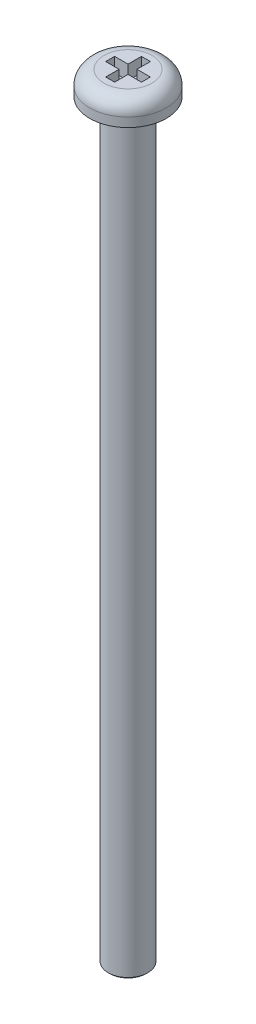
ISO-10303-21;
HEADER;
FILE_DESCRIPTION(('STEP AP214'),'2;1');
FILE_NAME('part.step','',(''),(''),'','','');
FILE_SCHEMA(('AUTOMOTIVE_DESIGN { 1 0 10303 214 1 1 1 1 }'));
ENDSEC;
DATA;
#1=APPLICATION_CONTEXT('core data for automotive mechanical design processes');
#2=APPLICATION_PROTOCOL_DEFINITION('international standard','automotive_design',2000,#1);
#3=PRODUCT_CONTEXT('',#1,'mechanical');
#4=PRODUCT('Part','Part','',(#3));
#5=PRODUCT_RELATED_PRODUCT_CATEGORY('part','',(#4));
#6=PRODUCT_DEFINITION_FORMATION('','',#4);
#7=PRODUCT_DEFINITION_CONTEXT('part definition',#1,'design');
#8=PRODUCT_DEFINITION('design','',#6,#7);
#9=PRODUCT_DEFINITION_SHAPE('','',#8);
#10=(LENGTH_UNIT() NAMED_UNIT(*) SI_UNIT(.MILLI.,.METRE.));
#11=(NAMED_UNIT(*) PLANE_ANGLE_UNIT() SI_UNIT($,.RADIAN.));
#12=(NAMED_UNIT(*) SI_UNIT($,.STERADIAN.) SOLID_ANGLE_UNIT());
#13=UNCERTAINTY_MEASURE_WITH_UNIT(LENGTH_MEASURE(1.E-05),#10,'distance_accuracy_value','');
#14=(GEOMETRIC_REPRESENTATION_CONTEXT(3) GLOBAL_UNCERTAINTY_ASSIGNED_CONTEXT((#13)) GLOBAL_UNIT_ASSIGNED_CONTEXT((#10,
#11,#12)) REPRESENTATION_CONTEXT('',''));
#15=CARTESIAN_POINT('',(0.,0.,0.));
#16=DIRECTION('',(0.,0.,1.));
#17=DIRECTION('',(1.,0.,0.));
#18=AXIS2_PLACEMENT_3D('',#15,#16,#17);
#19=CARTESIAN_POINT('',(0.,0.812800000000002,0.));
#20=DIRECTION('',(0.,1.,0.));
#21=DIRECTION('',(0.,0.,1.));
#22=AXIS2_PLACEMENT_3D('',#19,#20,#21);
#23=PLANE('',#22);
#24=DIRECTION('',(0.,0.,-1.));
#25=VECTOR('',#24,1.);
#26=CARTESIAN_POINT('',(1.5875,0.812800000000002,-0.396874999999998));
#27=LINE('',#26,#25);
#28=CARTESIAN_POINT('',(1.5875,0.812800000000002,0.396874999999998));
#29=VERTEX_POINT('',#28);
#30=CARTESIAN_POINT('',(1.5875,0.812800000000002,-0.396874999999998));
#31=VERTEX_POINT('',#30);
#32=EDGE_CURVE('E184',#29,#31,#27,.T.);
#33=ORIENTED_EDGE('',*,*,#32,.T.);
#34=DIRECTION('',(-1.,0.,0.));
#35=VECTOR('',#34,1.);
#36=CARTESIAN_POINT('',(0.396874999999998,0.812800000000002,-0.396874999999998));
#37=LINE('',#36,#35);
#38=CARTESIAN_POINT('',(0.396874999999998,0.812800000000002,-0.396874999999998));
#39=VERTEX_POINT('',#38);
#40=EDGE_CURVE('E188',#31,#39,#37,.T.);
#41=ORIENTED_EDGE('',*,*,#40,.T.);
#42=DIRECTION('',(0.,0.,-1.));
#43=VECTOR('',#42,1.);
#44=CARTESIAN_POINT('',(0.396874999999997,0.812800000000002,-1.5875));
#45=LINE('',#44,#43);
#46=CARTESIAN_POINT('',(0.396874999999997,0.812800000000002,-1.5875));
#47=VERTEX_POINT('',#46);
#48=EDGE_CURVE('E192',#39,#47,#45,.T.);
#49=ORIENTED_EDGE('',*,*,#48,.T.);
#50=DIRECTION('',(-1.,0.,0.));
#51=VECTOR('',#50,1.);
#52=CARTESIAN_POINT('',(-0.396874999999998,0.812800000000002,-1.5875));
#53=LINE('',#52,#51);
#54=CARTESIAN_POINT('',(-0.396874999999998,0.812800000000002,-1.5875));
#55=VERTEX_POINT('',#54);
#56=EDGE_CURVE('E196',#47,#55,#53,.T.);
#57=ORIENTED_EDGE('',*,*,#56,.T.);
#58=DIRECTION('',(0.,0.,1.));
#59=VECTOR('',#58,1.);
#60=CARTESIAN_POINT('',(-0.396874999999998,0.812800000000002,-1.5875));
#61=LINE('',#60,#59);
#62=CARTESIAN_POINT('',(-0.396874999999998,0.812800000000002,-0.396874999999998));
#63=VERTEX_POINT('',#62);
#64=EDGE_CURVE('E200',#55,#63,#61,.T.);
#65=ORIENTED_EDGE('',*,*,#64,.T.);
#66=DIRECTION('',(-1.,0.,0.));
#67=VECTOR('',#66,1.);
#68=CARTESIAN_POINT('',(-1.5875,0.812800000000002,-0.396874999999998));
#69=LINE('',#68,#67);
#70=CARTESIAN_POINT('',(-1.5875,0.812800000000002,-0.396874999999998));
#71=VERTEX_POINT('',#70);
#72=EDGE_CURVE('E204',#63,#71,#69,.T.);
#73=ORIENTED_EDGE('',*,*,#72,.T.);
#74=DIRECTION('',(0.,0.,1.));
#75=VECTOR('',#74,1.);
#76=CARTESIAN_POINT('',(-1.5875,0.812800000000002,-0.396874999999998));
#77=LINE('',#76,#75);
#78=CARTESIAN_POINT('',(-1.5875,0.812800000000002,0.396874999999998));
#79=VERTEX_POINT('',#78);
#80=EDGE_CURVE('E206',#71,#79,#77,.T.);
#81=ORIENTED_EDGE('',*,*,#80,.T.);
#82=DIRECTION('',(1.,0.,0.));
#83=VECTOR('',#82,1.);
#84=CARTESIAN_POINT('',(-1.5875,0.812800000000002,0.396874999999998));
#85=LINE('',#84,#83);
#86=CARTESIAN_POINT('',(-0.396874999999998,0.812800000000002,0.396874999999998));
#87=VERTEX_POINT('',#86);
#88=EDGE_CURVE('E122',#79,#87,#85,.T.);
#89=ORIENTED_EDGE('',*,*,#88,.T.);
#90=DIRECTION('',(0.,0.,1.));
#91=VECTOR('',#90,1.);
#92=CARTESIAN_POINT('',(-0.396874999999998,0.812800000000002,0.396874999999998));
#93=LINE('',#92,#91);
#94=CARTESIAN_POINT('',(-0.396874999999998,0.812800000000002,1.5875));
#95=VERTEX_POINT('',#94);
#96=EDGE_CURVE('E118',#87,#95,#93,.T.);
#97=ORIENTED_EDGE('',*,*,#96,.T.);
#98=DIRECTION('',(1.,0.,0.));
#99=VECTOR('',#98,1.);
#100=CARTESIAN_POINT('',(-0.396874999999997,0.812800000000002,1.5875));
#101=LINE('',#100,#99);
#102=CARTESIAN_POINT('',(0.396874999999998,0.812800000000002,1.5875));
#103=VERTEX_POINT('',#102);
#104=EDGE_CURVE('E172',#95,#103,#101,.T.);
#105=ORIENTED_EDGE('',*,*,#104,.T.);
#106=DIRECTION('',(0.,0.,-1.));
#107=VECTOR('',#106,1.);
#108=CARTESIAN_POINT('',(0.396874999999998,0.812800000000002,0.396874999999998));
#109=LINE('',#108,#107);
#110=CARTESIAN_POINT('',(0.396874999999998,0.812800000000002,0.396874999999998));
#111=VERTEX_POINT('',#110);
#112=EDGE_CURVE('E176',#103,#111,#109,.T.);
#113=ORIENTED_EDGE('',*,*,#112,.T.);
#114=DIRECTION('',(1.,0.,0.));
#115=VECTOR('',#114,1.);
#116=CARTESIAN_POINT('',(0.396874999999998,0.812800000000002,0.396874999999998));
#117=LINE('',#116,#115);
#118=EDGE_CURVE('E180',#111,#29,#117,.T.);
#119=ORIENTED_EDGE('',*,*,#118,.T.);
#120=EDGE_LOOP('',(#33,#41,#49,#57,#65,#73,#81,#89,#97,#105,#113,#119));
#121=FACE_BOUND('',#120,.T.);
#122=ADVANCED_FACE('F16',(#121),#23,.T.);
#123=CARTESIAN_POINT('',(-1.5875,0.812800000000002,-0.396874999999998));
#124=DIRECTION('',(-1.,0.,0.));
#125=DIRECTION('',(0.,0.,1.));
#126=AXIS2_PLACEMENT_3D('',#123,#124,#125);
#127=PLANE('',#126);
#128=ORIENTED_EDGE('',*,*,#80,.F.);
#129=DIRECTION('',(0.,1.,0.));
#130=VECTOR('',#129,1.);
#131=CARTESIAN_POINT('',(-1.5875,0.812800000000002,-0.396874999999998));
#132=LINE('',#131,#130);
#133=CARTESIAN_POINT('',(-1.5875,2.0828,-0.396874999999998));
#134=VERTEX_POINT('',#133);
#135=EDGE_CURVE('E202',#71,#134,#132,.T.);
#136=ORIENTED_EDGE('',*,*,#135,.T.);
#137=DIRECTION('',(0.,0.,1.));
#138=VECTOR('',#137,1.);
#139=CARTESIAN_POINT('',(-1.5875,2.0828,0.));
#140=LINE('',#139,#138);
#141=CARTESIAN_POINT('',(-1.5875,2.0828,0.396874999999998));
#142=VERTEX_POINT('',#141);
#143=EDGE_CURVE('E121',#142,#134,#140,.F.);
#144=ORIENTED_EDGE('',*,*,#143,.F.);
#145=DIRECTION('',(0.,1.,0.));
#146=VECTOR('',#145,1.);
#147=CARTESIAN_POINT('',(-1.5875,0.812800000000002,0.396874999999998));
#148=LINE('',#147,#146);
#149=EDGE_CURVE('E129',#142,#79,#148,.F.);
#150=ORIENTED_EDGE('',*,*,#149,.T.);
#151=EDGE_LOOP('',(#128,#136,#144,#150));
#152=FACE_BOUND('',#151,.T.);
#153=ADVANCED_FACE('F222',(#152),#127,.F.);
#154=CARTESIAN_POINT('',(-1.5875,0.812800000000002,-0.396874999999998));
#155=DIRECTION('',(0.,0.,-1.));
#156=DIRECTION('',(-1.,0.,0.));
#157=AXIS2_PLACEMENT_3D('',#154,#155,#156);
#158=PLANE('',#157);
#159=ORIENTED_EDGE('',*,*,#72,.F.);
#160=DIRECTION('',(0.,1.,0.));
#161=VECTOR('',#160,1.);
#162=CARTESIAN_POINT('',(-0.396874999999998,0.812800000000002,-0.396874999999998));
#163=LINE('',#162,#161);
#164=CARTESIAN_POINT('',(-0.396874999999998,2.0828,-0.396874999999998));
#165=VERTEX_POINT('',#164);
#166=EDGE_CURVE('E198',#63,#165,#163,.T.);
#167=ORIENTED_EDGE('',*,*,#166,.T.);
#168=DIRECTION('',(1.,0.,0.));
#169=VECTOR('',#168,1.);
#170=CARTESIAN_POINT('',(0.,2.0828,-0.396874999999998));
#171=LINE('',#170,#169);
#172=EDGE_CURVE('E161',#134,#165,#171,.T.);
#173=ORIENTED_EDGE('',*,*,#172,.F.);
#174=ORIENTED_EDGE('',*,*,#135,.F.);
#175=EDGE_LOOP('',(#159,#167,#173,#174));
#176=FACE_BOUND('',#175,.T.);
#177=ADVANCED_FACE('F226',(#176),#158,.F.);
#178=CARTESIAN_POINT('',(-0.396874999999998,0.812800000000002,-1.5875));
#179=DIRECTION('',(-1.,0.,0.));
#180=DIRECTION('',(0.,0.,1.));
#181=AXIS2_PLACEMENT_3D('',#178,#179,#180);
#182=PLANE('',#181);
#183=ORIENTED_EDGE('',*,*,#64,.F.);
#184=DIRECTION('',(0.,1.,0.));
#185=VECTOR('',#184,1.);
#186=CARTESIAN_POINT('',(-0.396874999999998,0.812800000000002,-1.5875));
#187=LINE('',#186,#185);
#188=CARTESIAN_POINT('',(-0.396874999999998,2.0828,-1.5875));
#189=VERTEX_POINT('',#188);
#190=EDGE_CURVE('E194',#55,#189,#187,.T.);
#191=ORIENTED_EDGE('',*,*,#190,.T.);
#192=DIRECTION('',(0.,0.,1.));
#193=VECTOR('',#192,1.);
#194=CARTESIAN_POINT('',(-0.396874999999998,2.0828,0.));
#195=LINE('',#194,#193);
#196=EDGE_CURVE('E158',#165,#189,#195,.F.);
#197=ORIENTED_EDGE('',*,*,#196,.F.);
#198=ORIENTED_EDGE('',*,*,#166,.F.);
#199=EDGE_LOOP('',(#183,#191,#197,#198));
#200=FACE_BOUND('',#199,.T.);
#201=ADVANCED_FACE('F230',(#200),#182,.F.);
#202=CARTESIAN_POINT('',(-0.396874999999998,0.812800000000002,-1.5875));
#203=DIRECTION('',(0.,0.,-1.));
#204=DIRECTION('',(-1.,0.,0.));
#205=AXIS2_PLACEMENT_3D('',#202,#203,#204);
#206=PLANE('',#205);
#207=ORIENTED_EDGE('',*,*,#56,.F.);
#208=DIRECTION('',(0.,1.,0.));
#209=VECTOR('',#208,1.);
#210=CARTESIAN_POINT('',(0.396874999999997,0.812800000000002,-1.5875));
#211=LINE('',#210,#209);
#212=CARTESIAN_POINT('',(0.396874999999997,2.0828,-1.5875));
#213=VERTEX_POINT('',#212);
#214=EDGE_CURVE('E190',#47,#213,#211,.T.);
#215=ORIENTED_EDGE('',*,*,#214,.T.);
#216=DIRECTION('',(1.,0.,0.));
#217=VECTOR('',#216,1.);
#218=CARTESIAN_POINT('',(0.,2.0828,-1.5875));
#219=LINE('',#218,#217);
#220=EDGE_CURVE('E155',#189,#213,#219,.T.);
#221=ORIENTED_EDGE('',*,*,#220,.F.);
#222=ORIENTED_EDGE('',*,*,#190,.F.);
#223=EDGE_LOOP('',(#207,#215,#221,#222));
#224=FACE_BOUND('',#223,.T.);
#225=ADVANCED_FACE('F234',(#224),#206,.F.);
#226=CARTESIAN_POINT('',(0.396874999999997,0.812800000000002,-1.5875));
#227=DIRECTION('',(1.,0.,0.));
#228=DIRECTION('',(0.,0.,-1.));
#229=AXIS2_PLACEMENT_3D('',#226,#227,#228);
#230=PLANE('',#229);
#231=ORIENTED_EDGE('',*,*,#48,.F.);
#232=DIRECTION('',(0.,1.,0.));
#233=VECTOR('',#232,1.);
#234=CARTESIAN_POINT('',(0.396874999999998,0.812800000000002,-0.396874999999998));
#235=LINE('',#234,#233);
#236=CARTESIAN_POINT('',(0.396874999999997,2.0828,-0.396874999999998));
#237=VERTEX_POINT('',#236);
#238=EDGE_CURVE('E186',#39,#237,#235,.T.);
#239=ORIENTED_EDGE('',*,*,#238,.T.);
#240=DIRECTION('',(0.,0.,1.));
#241=VECTOR('',#240,1.);
#242=CARTESIAN_POINT('',(0.396874999999997,2.0828,0.));
#243=LINE('',#242,#241);
#244=EDGE_CURVE('E152',#213,#237,#243,.T.);
#245=ORIENTED_EDGE('',*,*,#244,.F.);
#246=ORIENTED_EDGE('',*,*,#214,.F.);
#247=EDGE_LOOP('',(#231,#239,#245,#246));
#248=FACE_BOUND('',#247,.T.);
#249=ADVANCED_FACE('F238',(#248),#230,.F.);
#250=CARTESIAN_POINT('',(0.396874999999998,0.812800000000002,-0.396874999999998));
#251=DIRECTION('',(0.,0.,-1.));
#252=DIRECTION('',(-1.,0.,0.));
#253=AXIS2_PLACEMENT_3D('',#250,#251,#252);
#254=PLANE('',#253);
#255=ORIENTED_EDGE('',*,*,#40,.F.);
#256=DIRECTION('',(0.,1.,0.));
#257=VECTOR('',#256,1.);
#258=CARTESIAN_POINT('',(1.5875,0.812800000000002,-0.396874999999998));
#259=LINE('',#258,#257);
#260=CARTESIAN_POINT('',(1.5875,2.0828,-0.396874999999998));
#261=VERTEX_POINT('',#260);
#262=EDGE_CURVE('E182',#31,#261,#259,.T.);
#263=ORIENTED_EDGE('',*,*,#262,.T.);
#264=DIRECTION('',(1.,0.,0.));
#265=VECTOR('',#264,1.);
#266=CARTESIAN_POINT('',(0.,2.0828,-0.396874999999998));
#267=LINE('',#266,#265);
#268=EDGE_CURVE('E149',#237,#261,#267,.T.);
#269=ORIENTED_EDGE('',*,*,#268,.F.);
#270=ORIENTED_EDGE('',*,*,#238,.F.);
#271=EDGE_LOOP('',(#255,#263,#269,#270));
#272=FACE_BOUND('',#271,.T.);
#273=ADVANCED_FACE('F242',(#272),#254,.F.);
#274=CARTESIAN_POINT('',(1.5875,0.812800000000002,-0.396874999999998));
#275=DIRECTION('',(1.,0.,0.));
#276=DIRECTION('',(0.,0.,-1.));
#277=AXIS2_PLACEMENT_3D('',#274,#275,#276);
#278=PLANE('',#277);
#279=ORIENTED_EDGE('',*,*,#32,.F.);
#280=DIRECTION('',(0.,1.,0.));
#281=VECTOR('',#280,1.);
#282=CARTESIAN_POINT('',(1.5875,0.812800000000002,0.396874999999998));
#283=LINE('',#282,#281);
#284=CARTESIAN_POINT('',(1.5875,2.0828,0.396874999999998));
#285=VERTEX_POINT('',#284);
#286=EDGE_CURVE('E178',#29,#285,#283,.T.);
#287=ORIENTED_EDGE('',*,*,#286,.T.);
#288=DIRECTION('',(0.,0.,1.));
#289=VECTOR('',#288,1.);
#290=CARTESIAN_POINT('',(1.5875,2.0828,0.));
#291=LINE('',#290,#289);
#292=EDGE_CURVE('E146',#261,#285,#291,.T.);
#293=ORIENTED_EDGE('',*,*,#292,.F.);
#294=ORIENTED_EDGE('',*,*,#262,.F.);
#295=EDGE_LOOP('',(#279,#287,#293,#294));
#296=FACE_BOUND('',#295,.T.);
#297=ADVANCED_FACE('F246',(#296),#278,.F.);
#298=CARTESIAN_POINT('',(0.396874999999998,0.812800000000002,0.396874999999998));
#299=DIRECTION('',(0.,0.,1.));
#300=DIRECTION('',(1.,0.,0.));
#301=AXIS2_PLACEMENT_3D('',#298,#299,#300);
#302=PLANE('',#301);
#303=ORIENTED_EDGE('',*,*,#118,.F.);
#304=DIRECTION('',(0.,1.,0.));
#305=VECTOR('',#304,1.);
#306=CARTESIAN_POINT('',(0.396874999999998,0.812800000000002,0.396874999999998));
#307=LINE('',#306,#305);
#308=CARTESIAN_POINT('',(0.396874999999998,2.0828,0.396874999999998));
#309=VERTEX_POINT('',#308);
#310=EDGE_CURVE('E174',#111,#309,#307,.T.);
#311=ORIENTED_EDGE('',*,*,#310,.T.);
#312=DIRECTION('',(1.,0.,0.));
#313=VECTOR('',#312,1.);
#314=CARTESIAN_POINT('',(0.,2.0828,0.396874999999998));
#315=LINE('',#314,#313);
#316=EDGE_CURVE('E143',#285,#309,#315,.F.);
#317=ORIENTED_EDGE('',*,*,#316,.F.);
#318=ORIENTED_EDGE('',*,*,#286,.F.);
#319=EDGE_LOOP('',(#303,#311,#317,#318));
#320=FACE_BOUND('',#319,.T.);
#321=ADVANCED_FACE('F250',(#320),#302,.F.);
#322=CARTESIAN_POINT('',(0.396874999999998,0.812800000000002,0.396874999999998));
#323=DIRECTION('',(1.,0.,0.));
#324=DIRECTION('',(0.,0.,-1.));
#325=AXIS2_PLACEMENT_3D('',#322,#323,#324);
#326=PLANE('',#325);
#327=ORIENTED_EDGE('',*,*,#112,.F.);
#328=DIRECTION('',(0.,1.,0.));
#329=VECTOR('',#328,1.);
#330=CARTESIAN_POINT('',(0.396874999999999,0.812800000000002,1.5875));
#331=LINE('',#330,#329);
#332=CARTESIAN_POINT('',(0.396874999999998,2.0828,1.5875));
#333=VERTEX_POINT('',#332);
#334=EDGE_CURVE('E170',#103,#333,#331,.T.);
#335=ORIENTED_EDGE('',*,*,#334,.T.);
#336=DIRECTION('',(0.,0.,1.));
#337=VECTOR('',#336,1.);
#338=CARTESIAN_POINT('',(0.396874999999998,2.0828,0.));
#339=LINE('',#338,#337);
#340=EDGE_CURVE('E138',#309,#333,#339,.T.);
#341=ORIENTED_EDGE('',*,*,#340,.F.);
#342=ORIENTED_EDGE('',*,*,#310,.F.);
#343=EDGE_LOOP('',(#327,#335,#341,#342));
#344=FACE_BOUND('',#343,.T.);
#345=ADVANCED_FACE('F254',(#344),#326,.F.);
#346=CARTESIAN_POINT('',(-0.396874999999997,0.812800000000002,1.5875));
#347=DIRECTION('',(0.,0.,1.));
#348=DIRECTION('',(1.,0.,0.));
#349=AXIS2_PLACEMENT_3D('',#346,#347,#348);
#350=PLANE('',#349);
#351=ORIENTED_EDGE('',*,*,#104,.F.);
#352=DIRECTION('',(0.,1.,0.));
#353=VECTOR('',#352,1.);
#354=CARTESIAN_POINT('',(-0.396874999999998,0.812800000000002,1.5875));
#355=LINE('',#354,#353);
#356=CARTESIAN_POINT('',(-0.396874999999997,2.0828,1.5875));
#357=VERTEX_POINT('',#356);
#358=EDGE_CURVE('E167',#95,#357,#355,.T.);
#359=ORIENTED_EDGE('',*,*,#358,.T.);
#360=DIRECTION('',(1.,0.,0.));
#361=VECTOR('',#360,1.);
#362=CARTESIAN_POINT('',(0.,2.0828,1.5875));
#363=LINE('',#362,#361);
#364=EDGE_CURVE('E136',#333,#357,#363,.F.);
#365=ORIENTED_EDGE('',*,*,#364,.F.);
#366=ORIENTED_EDGE('',*,*,#334,.F.);
#367=EDGE_LOOP('',(#351,#359,#365,#366));
#368=FACE_BOUND('',#367,.T.);
#369=ADVANCED_FACE('F258',(#368),#350,.F.);
#370=CARTESIAN_POINT('',(-0.396874999999998,0.812800000000002,0.396874999999998));
#371=DIRECTION('',(-1.,0.,0.));
#372=DIRECTION('',(0.,0.,1.));
#373=AXIS2_PLACEMENT_3D('',#370,#371,#372);
#374=PLANE('',#373);
#375=ORIENTED_EDGE('',*,*,#96,.F.);
#376=DIRECTION('',(0.,1.,0.));
#377=VECTOR('',#376,1.);
#378=CARTESIAN_POINT('',(-0.396874999999998,0.812800000000002,0.396874999999998));
#379=LINE('',#378,#377);
#380=CARTESIAN_POINT('',(-0.396874999999998,2.0828,0.396874999999998));
#381=VERTEX_POINT('',#380);
#382=EDGE_CURVE('E111',#87,#381,#379,.T.);
#383=ORIENTED_EDGE('',*,*,#382,.T.);
#384=DIRECTION('',(0.,0.,1.));
#385=VECTOR('',#384,1.);
#386=CARTESIAN_POINT('',(-0.396874999999997,2.0828,0.));
#387=LINE('',#386,#385);
#388=EDGE_CURVE('E116',#357,#381,#387,.F.);
#389=ORIENTED_EDGE('',*,*,#388,.F.);
#390=ORIENTED_EDGE('',*,*,#358,.F.);
#391=EDGE_LOOP('',(#375,#383,#389,#390));
#392=FACE_BOUND('',#391,.T.);
#393=ADVANCED_FACE('F113',(#392),#374,.F.);
#394=CARTESIAN_POINT('',(-1.5875,0.812800000000002,0.396874999999998));
#395=DIRECTION('',(0.,0.,1.));
#396=DIRECTION('',(1.,0.,0.));
#397=AXIS2_PLACEMENT_3D('',#394,#395,#396);
#398=PLANE('',#397);
#399=ORIENTED_EDGE('',*,*,#88,.F.);
#400=ORIENTED_EDGE('',*,*,#149,.F.);
#401=DIRECTION('',(1.,0.,0.));
#402=VECTOR('',#401,1.);
#403=CARTESIAN_POINT('',(0.,2.0828,0.396874999999998));
#404=LINE('',#403,#402);
#405=EDGE_CURVE('E126',#381,#142,#404,.F.);
#406=ORIENTED_EDGE('',*,*,#405,.F.);
#407=ORIENTED_EDGE('',*,*,#382,.F.);
#408=EDGE_LOOP('',(#399,#400,#406,#407));
#409=FACE_BOUND('',#408,.T.);
#410=ADVANCED_FACE('F127',(#409),#398,.F.);
#411=CARTESIAN_POINT('',(0.,2.0828,0.));
#412=DIRECTION('',(0.,1.,0.));
#413=DIRECTION('',(0.,0.,1.));
#414=AXIS2_PLACEMENT_3D('',#411,#412,#413);
#415=PLANE('',#414);
#416=ORIENTED_EDGE('',*,*,#388,.T.);
#417=ORIENTED_EDGE('',*,*,#405,.T.);
#418=ORIENTED_EDGE('',*,*,#143,.T.);
#419=ORIENTED_EDGE('',*,*,#172,.T.);
#420=ORIENTED_EDGE('',*,*,#196,.T.);
#421=ORIENTED_EDGE('',*,*,#220,.T.);
#422=ORIENTED_EDGE('',*,*,#244,.T.);
#423=ORIENTED_EDGE('',*,*,#268,.T.);
#424=ORIENTED_EDGE('',*,*,#292,.T.);
#425=ORIENTED_EDGE('',*,*,#316,.T.);
#426=ORIENTED_EDGE('',*,*,#340,.T.);
#427=ORIENTED_EDGE('',*,*,#364,.T.);
#428=EDGE_LOOP('',(#416,#417,#418,#419,#420,#421,#422,#423,#424,#425,#426,#427));
#429=FACE_BOUND('',#428,.T.);
#430=CARTESIAN_POINT('',(0.,2.0828,-2.1336));
#431=CARTESIAN_POINT('',(0.0326898817068633,2.0828,-2.1336005694083));
#432=CARTESIAN_POINT('',(0.0653797180495962,2.0828,-2.13284873604939));
#433=CARTESIAN_POINT('',(0.130690362599788,2.0828,-2.12984435206687));
#434=CARTESIAN_POINT('',(0.163311170807246,2.0828,-2.12759180144327));
#435=CARTESIAN_POINT('',(0.228414821679876,2.0828,-2.12159007120115));
#436=CARTESIAN_POINT('',(0.260897664345047,2.0828,-2.11784089158263));
#437=CARTESIAN_POINT('',(0.32565677722639,2.0828,-2.10885400243004));
#438=CARTESIAN_POINT('',(0.357933047442563,2.0828,-2.10361629289597));
#439=CARTESIAN_POINT('',(0.422210834409674,2.0828,-2.09166335971463));
#440=CARTESIAN_POINT('',(0.454212351160613,2.0828,-2.08494813606735));
#441=CARTESIAN_POINT('',(0.517873033340183,2.0828,-2.07005437238435));
#442=CARTESIAN_POINT('',(0.549532198768813,2.0828,-2.06187583234862));
#443=CARTESIAN_POINT('',(0.612441302942122,2.0828,-2.04407270864914));
#444=CARTESIAN_POINT('',(0.643691241686801,2.0828,-2.03444812498539));
#445=CARTESIAN_POINT('',(0.70571588146025,2.0828,-2.01377324445576));
#446=CARTESIAN_POINT('',(0.736490582489019,2.0828,-2.00272294758988));
#447=CARTESIAN_POINT('',(0.79749974074089,2.08280000000001,-1.97921998623489));
#448=CARTESIAN_POINT('',(0.827734197963991,2.08280000000002,-1.96676732174578));
#449=CARTESIAN_POINT('',(0.887598999506393,2.08279999999999,-1.94048591571605));
#450=CARTESIAN_POINT('',(0.917229343825693,2.08279999999994,-1.92665717417543));
#451=CARTESIAN_POINT('',(0.975823342258878,2.08280000000006,-1.89765287702439));
#452=CARTESIAN_POINT('',(1.00478699637276,2.08280000000023,-1.88247732141397));
#453=CARTESIAN_POINT('',(1.06198638677769,2.08279999999978,-1.85081125873903));
#454=CARTESIAN_POINT('',(1.09022212306873,2.08279999999917,-1.83432075167451));
#455=CARTESIAN_POINT('',(1.14590620652822,2.08280000000084,-1.8000603419333));
#456=CARTESIAN_POINT('',(1.17335455369667,2.08280000000311,-1.78229043925662));
#457=CARTESIAN_POINT('',(1.22740523465358,2.08279999999689,-1.74550607962601));
#458=CARTESIAN_POINT('',(1.25400756844204,2.0827999999884,-1.72649162267208));
#459=CARTESIAN_POINT('',(1.29794459229675,2.08280000000789,-1.69354339255194));
#460=CARTESIAN_POINT('',(1.31552112783632,2.08280000002508,-1.6799306265201));
#461=CARTESIAN_POINT('',(1.3502469105536,2.08279999984912,-1.6521696664561));
#462=CARTESIAN_POINT('',(1.36739615321164,2.08279999965596,-1.6380214667644));
#463=CARTESIAN_POINT('',(1.40124978160645,2.08279999833107,-1.60920174137223));
#464=CARTESIAN_POINT('',(1.41795415729623,2.08279999719931,-1.59453020387004));
#465=CARTESIAN_POINT('',(1.45090258144889,2.08279999261002,-1.56467835399572));
#466=CARTESIAN_POINT('',(1.4671466139845,2.0827999891524,-1.5494980240596));
#467=CARTESIAN_POINT('',(1.5071618700048,2.08279997601219,-1.51092737655085));
#468=CARTESIAN_POINT('',(1.53063553668584,2.08279996408146,-1.48722726290827));
#469=CARTESIAN_POINT('',(1.57646709785272,2.08279992079263,-1.43876595451112));
#470=CARTESIAN_POINT('',(1.59882488411776,2.08279988943265,-1.41400465727153));
#471=CARTESIAN_POINT('',(1.62783594887987,2.08279983548886,-1.38032018884017));
#472=CARTESIAN_POINT('',(1.63501771417288,2.08279982100232,-1.37184863488135));
#473=CARTESIAN_POINT('',(1.64924225133114,2.08279979505328,-1.35478908347554));
#474=CARTESIAN_POINT('',(1.65628501912919,2.08279978359086,-1.34620108263357));
#475=CARTESIAN_POINT('',(1.67720414065923,2.08279975374085,-1.3202677848227));
#476=CARTESIAN_POINT('',(1.69087139961437,2.08279973989029,-1.30275309147028));
#477=CARTESIAN_POINT('',(1.71763165117075,2.08279972891874,-1.26729066599298));
#478=CARTESIAN_POINT('',(1.73072463968773,2.08279973179785,-1.24934293078967));
#479=CARTESIAN_POINT('',(1.75632309345866,2.08279975330488,-1.21303382684637));
#480=CARTESIAN_POINT('',(1.76882857462668,2.08279977193237,-1.19467246933031));
#481=CARTESIAN_POINT('',(1.79323738508853,2.08279981968414,-1.15755551213029));
#482=CARTESIAN_POINT('',(1.8051407512581,2.08279984880777,-1.13879993668954));
#483=CARTESIAN_POINT('',(1.82833618583959,2.08279990786222,-1.10091679421922));
#484=CARTESIAN_POINT('',(1.83962831254455,2.08279993779296,-1.08178926289989));
#485=CARTESIAN_POINT('',(1.86157570227613,2.08279998365496,-1.04317573977303));
#486=CARTESIAN_POINT('',(1.87223104775447,2.08279999958802,-1.02368979480279));
#487=CARTESIAN_POINT('',(1.89403109987932,2.08280000045517,-0.982345301755482));
#488=CARTESIAN_POINT('',(1.90511002243382,2.08279998196475,-0.96045216008615));
#489=CARTESIAN_POINT('',(1.92659489782662,2.08279995869967,-0.916339777137992));
#490=CARTESIAN_POINT('',(1.93700090638308,2.08279995392386,-0.894120563045799));
#491=CARTESIAN_POINT('',(1.95457253575608,2.08279996562981,-0.854951383278733));
#492=CARTESIAN_POINT('',(1.96189793812528,2.08279997709624,-0.838072627370221));
#493=CARTESIAN_POINT('',(1.9762122236215,2.08279999299281,-0.804169017644803));
#494=CARTESIAN_POINT('',(1.98320107501083,2.08279999742229,-0.787144150226851));
#495=CARTESIAN_POINT('',(1.99389343395484,2.08279999947434,-0.759668388084427));
#496=CARTESIAN_POINT('',(1.99779814446072,2.08279999910341,-0.749295720271593));
#497=CARTESIAN_POINT('',(2.01294804041389,2.0827999983263,-0.708135309751569));
#498=CARTESIAN_POINT('',(2.0236019165125,2.08279999927218,-0.67712652417993));
#499=CARTESIAN_POINT('',(2.03932768114854,2.08279999984787,-0.627600651672225));
#500=CARTESIAN_POINT('',(2.04488238790165,2.08279999986076,-0.609235295666574));
#501=CARTESIAN_POINT('',(2.05645661406455,2.08279999992722,-0.569026739390114));
#502=CARTESIAN_POINT('',(2.06237843615475,2.08279999998772,-0.547155410549249));
#503=CARTESIAN_POINT('',(2.07727230767135,2.08280000002055,-0.488455990764676));
#504=CARTESIAN_POINT('',(2.08561585573144,2.08279999990617,-0.451465625280097));
#505=CARTESIAN_POINT('',(2.09664733332817,2.08279999976089,-0.395692583942351));
#506=CARTESIAN_POINT('',(2.1000772954017,2.08279999971685,-0.377052883924561));
#507=CARTESIAN_POINT('',(2.10644040049495,2.08279999964315,-0.339688414687159));
#508=CARTESIAN_POINT('',(2.10937354468164,2.08279999961349,-0.320963645667472));
#509=CARTESIAN_POINT('',(2.11563539180931,2.08279999957402,-0.277189276927993));
#510=CARTESIAN_POINT('',(2.11877009232772,2.08279999957412,-0.252111734508754));
#511=CARTESIAN_POINT('',(2.12414845358275,2.08279999961903,-0.201861466523305));
#512=CARTESIAN_POINT('',(2.12639211320308,2.08279999966384,-0.176688740837891));
#513=CARTESIAN_POINT('',(2.12998554661774,2.08279999977585,-0.126279467435563));
#514=CARTESIAN_POINT('',(2.13133531705253,2.08279999984305,-0.10104291947914));
#515=CARTESIAN_POINT('',(2.13313956546464,2.08279999995524,-0.0505374975778596));
#516=CARTESIAN_POINT('',(2.13359403783397,2.08280000000024,-0.0252686234315075));
#517=CARTESIAN_POINT('',(2.13360470708931,2.08279999999982,0.0199494054305972));
#518=CARTESIAN_POINT('',(2.1333298580138,2.08279999997144,0.0398986545907686));
#519=CARTESIAN_POINT('',(2.13222048026913,2.0827999998635,0.0797812751515323));
#520=CARTESIAN_POINT('',(2.13138594787224,2.08279999978393,0.0997146464454855));
#521=CARTESIAN_POINT('',(2.12804381807258,2.08279999947747,0.159467666051439));
#522=CARTESIAN_POINT('',(2.12469768879857,2.08279999918281,0.199243772524942));
#523=CARTESIAN_POINT('',(2.11577982299591,2.08279999845642,0.278543770740155));
#524=CARTESIAN_POINT('',(2.11020806011491,2.08279999802469,0.31806765948988));
#525=CARTESIAN_POINT('',(2.09685639472055,2.08279999706432,0.396741780948061));
#526=CARTESIAN_POINT('',(2.08907646824096,2.08279999653568,0.435892009596245));
#527=CARTESIAN_POINT('',(2.07133293652092,2.08279999541816,0.5136946916516));
#528=CARTESIAN_POINT('',(2.06136930973474,2.08279999482928,0.552347140143386));
#529=CARTESIAN_POINT('',(2.03928971112441,2.08279999362445,0.629032740953426));
#530=CARTESIAN_POINT('',(2.02717372018766,2.0827999930085,0.667065887769121));
#531=CARTESIAN_POINT('',(2.00082751282304,2.08279999177923,0.742393036899034));
#532=CARTESIAN_POINT('',(1.98659727970732,2.0827999911659,0.779687033376451));
#533=CARTESIAN_POINT('',(1.95606737016234,2.08279998996806,0.853418434780798));
#534=CARTESIAN_POINT('',(1.93976767944063,2.08279998938354,0.889855833789684));
#535=CARTESIAN_POINT('',(1.90515015922736,2.08279998826602,0.961759270893862));
#536=CARTESIAN_POINT('',(1.88683231778892,2.08279998773302,0.997225303237389));
#537=CARTESIAN_POINT('',(1.84823616114613,2.08279998673772,1.06707430245566));
#538=CARTESIAN_POINT('',(1.82795783627056,2.08279998627544,1.10145726398642));
#539=CARTESIAN_POINT('',(1.78550455652476,2.0827999854373,1.1690318273599));
#540=CARTESIAN_POINT('',(1.76332959416952,2.08279998506144,1.20222342450022));
#541=CARTESIAN_POINT('',(1.71715286073616,2.08279998440839,1.26731071853662));
#542=CARTESIAN_POINT('',(1.69315108425094,2.08279998413119,1.29920641159659));
#543=CARTESIAN_POINT('',(1.64339630122117,2.08279998368418,1.36160143977341));
#544=CARTESIAN_POINT('',(1.617643291221,2.08279998351437,1.39210077213469));
#545=CARTESIAN_POINT('',(1.56446713893472,2.08279998328738,1.45160702100136));
#546=CARTESIAN_POINT('',(1.53704399500081,2.08279998323019,1.48061393603422));
#547=CARTESIAN_POINT('',(1.4806139360343,2.08279998323019,1.53704399500089));
#548=CARTESIAN_POINT('',(1.45160702100171,2.08279998328738,1.5644671389347));
#549=CARTESIAN_POINT('',(1.39210077213434,2.08279998351437,1.61764329122102));
#550=CARTESIAN_POINT('',(1.3616014397721,2.08279998368418,1.64339630122135));
#551=CARTESIAN_POINT('',(1.2992064115979,2.08279998413119,1.69315108425076));
#552=CARTESIAN_POINT('',(1.26731071854151,2.08279998440839,1.71715286073548));
#553=CARTESIAN_POINT('',(1.20222342449533,2.08279998506144,1.76332959417021));
#554=CARTESIAN_POINT('',(1.16903182734165,2.0827999854373,1.78550455652734));
#555=CARTESIAN_POINT('',(1.10145726400467,2.08279998627544,1.82795783626799));
#556=CARTESIAN_POINT('',(1.06707430252379,2.08279998673772,1.84823616113652));
#557=CARTESIAN_POINT('',(0.997225303169258,2.08279998773302,1.88683231779853));
#558=CARTESIAN_POINT('',(0.961759270639593,2.08279998826602,1.90515015926322));
#559=CARTESIAN_POINT('',(0.889855834043951,2.08279998938354,1.93976767940477));
#560=CARTESIAN_POINT('',(0.853418435729734,2.08279998996806,1.95606737002851));
#561=CARTESIAN_POINT('',(0.779687032427522,2.0827999911659,1.98659727984114));
#562=CARTESIAN_POINT('',(0.742393033357594,2.08279999177923,2.00082751332247));
#563=CARTESIAN_POINT('',(0.667065891310535,2.0827999930085,2.02717371968823));
#564=CARTESIAN_POINT('',(0.629032754170108,2.08279999362445,2.03928970926054));
#565=CARTESIAN_POINT('',(0.552347126926821,2.08279999482928,2.06136931159859));
#566=CARTESIAN_POINT('',(0.513694642326926,2.08279999541816,2.07133294347687));
#567=CARTESIAN_POINT('',(0.435892058920432,2.08279999653569,2.08907646128508));
#568=CARTESIAN_POINT('',(0.396741965027532,2.08279999706433,2.09685636876096));
#569=CARTESIAN_POINT('',(0.318067475412408,2.08279999802468,2.11020808607422));
#570=CARTESIAN_POINT('',(0.278543083757375,2.08279999845638,2.11577991987684));
#571=CARTESIAN_POINT('',(0.199244459499588,2.08279999918286,2.12469759191878));
#572=CARTESIAN_POINT('',(0.159470229860638,2.08279999947764,2.12804345651443));
#573=CARTESIAN_POINT('',(0.0797972818459309,2.0827999998859,2.13250019203327));
#574=CARTESIAN_POINT('',(0.0398985650735913,2.08279999999937,2.13361109162518));
#575=CARTESIAN_POINT('',(0.,2.0828,2.1336));
#576=B_SPLINE_CURVE_WITH_KNOTS('',3,(#430,#431,#432,#433,#434,#435,#436,#437,#438,#439,#440,
#441,#442,#443,#444,#445,#446,#447,#448,#449,#450,#451,#452,#453,#454,#455,#456,#457,#458,#459,
#460,#461,#462,#463,#464,#465,#466,#467,#468,#469,#470,#471,#472,#473,#474,#475,#476,#477,#478,
#479,#480,#481,#482,#483,#484,#485,#486,#487,#488,#489,#490,#491,#492,#493,#494,#495,#496,#497,
#498,#499,#500,#501,#502,#503,#504,#505,#506,#507,#508,#509,#510,#511,#512,#513,#514,#515,#516,
#517,#518,#519,#520,#521,#522,#523,#524,#525,#526,#527,#528,#529,#530,#531,#532,#533,#534,#535,
#536,#537,#538,#539,#540,#541,#542,#543,#544,#545,#546,#547,#548,#549,#550,#551,#552,#553,#554,
#555,#556,#557,#558,#559,#560,#561,#562,#563,#564,#565,#566,#567,#568,#569,#570,#571,#572,#573,
#574,#575),.UNSPECIFIED.,.F.,.F.,(4,2,2,2,2,2,2,2,2,2,2,2,2,2,2,2,2,2,2,2,2,2,2,2,2,2,2,2,2,2,2,
2,2,2,2,2,2,2,2,2,2,2,2,2,2,2,2,2,2,2,2,2,2,2,2,2,2,2,2,2,2,2,2,2,2,2,2,2,2,2,2,2,4),(0.,
0.0980609361323146,0.196121872264628,0.294182808396945,0.392243744529259,0.490304680661574,
0.588365616793889,0.686426552926203,0.784487489058518,0.882548425190832,0.980609361323148,
1.07867029745546,1.17673123358778,1.27479216972009,1.37285310585241,1.43953806267892,
1.50622372456249,1.57291089121702,1.63960036235175,1.73963567181692,1.83968066417351,
1.87299786633824,1.90631604195536,1.9729519930735,2.03958841803437,2.10622303694263,
2.17285356994615,2.23947773725398,2.30609325915437,2.37969165577131,2.45328395051966,
2.50848042748664,2.56368209948142,2.5969304407987,2.69525485689655,2.75280957487515,
2.82077613528667,2.93447230113087,2.99132504978852,3.04817766490278,3.12397934497264,
3.1997811200045,3.27558317992231,3.35138571465004,3.41123129753465,3.47107727902178,
3.59075859976018,3.71044133761275,3.83012537448667,3.94981059228908,4.06949687292714,
4.18918409830801,4.30887215033883,4.42856091092676,4.54825026197895,4.66794008540254,
4.78763026310469,4.90732067699255,5.02701120897325,5.14670174095396,5.26639215484181,
5.38608233254396,5.50577215596755,5.62546150701974,5.74515026760767,5.86483831963849,
5.98452554501936,6.10421182565742,6.22389704345983,6.34358108033375,6.46326381818633,
6.58294513892473,6.70262492445611),.UNSPECIFIED.);
#577=CARTESIAN_POINT('',(1.28895684126969E-06,2.0828,-2.13359999999922));
#578=VERTEX_POINT('',#577);
#579=CARTESIAN_POINT('',(-1.28895682468218E-06,2.0828,2.13359999999922));
#580=VERTEX_POINT('',#579);
#581=EDGE_CURVE('E33',#578,#580,#576,.T.);
#582=ORIENTED_EDGE('',*,*,#581,.F.);
#583=CARTESIAN_POINT('',(0.,2.0828,2.1336));
#584=CARTESIAN_POINT('',(-0.0326898817068631,2.0828,2.1336005694083));
#585=CARTESIAN_POINT('',(-0.0653797180495958,2.0828,2.13284873604939));
#586=CARTESIAN_POINT('',(-0.130690362599788,2.0828,2.12984435206687));
#587=CARTESIAN_POINT('',(-0.163311170807247,2.0828,2.12759180144327));
#588=CARTESIAN_POINT('',(-0.228414821679877,2.0828,2.12159007120115));
#589=CARTESIAN_POINT('',(-0.260897664345048,2.0828,2.11784089158263));
#590=CARTESIAN_POINT('',(-0.32565677722639,2.0828,2.10885400243004));
#591=CARTESIAN_POINT('',(-0.357933047442562,2.0828,2.10361629289597));
#592=CARTESIAN_POINT('',(-0.422210834409673,2.0828,2.09166335971463));
#593=CARTESIAN_POINT('',(-0.454212351160612,2.0828,2.08494813606735));
#594=CARTESIAN_POINT('',(-0.517873033340182,2.0828,2.07005437238435));
#595=CARTESIAN_POINT('',(-0.549532198768813,2.0828,2.06187583234862));
#596=CARTESIAN_POINT('',(-0.612441302942122,2.0828,2.04407270864914));
#597=CARTESIAN_POINT('',(-0.643691241686802,2.0828,2.03444812498539));
#598=CARTESIAN_POINT('',(-0.70571588146025,2.0828,2.01377324445576));
#599=CARTESIAN_POINT('',(-0.736490582489018,2.0828,2.00272294758988));
#600=CARTESIAN_POINT('',(-0.79749974074089,2.08280000000001,1.97921998623489));
#601=CARTESIAN_POINT('',(-0.827734197963993,2.08280000000002,1.96676732174578));
#602=CARTESIAN_POINT('',(-0.887598999506395,2.08279999999999,1.94048591571605));
#603=CARTESIAN_POINT('',(-0.917229343825694,2.08279999999994,1.92665717417543));
#604=CARTESIAN_POINT('',(-0.975823342258879,2.08280000000006,1.89765287702439));
#605=CARTESIAN_POINT('',(-1.00478699637276,2.08280000000023,1.88247732141397));
#606=CARTESIAN_POINT('',(-1.06198638677769,2.08279999999978,1.85081125873903));
#607=CARTESIAN_POINT('',(-1.09022212306873,2.08279999999917,1.83432075167451));
#608=CARTESIAN_POINT('',(-1.14590620652822,2.08280000000084,1.8000603419333));
#609=CARTESIAN_POINT('',(-1.17335455369667,2.08280000000311,1.78229043925662));
#610=CARTESIAN_POINT('',(-1.22740523465358,2.08279999999689,1.74550607962601));
#611=CARTESIAN_POINT('',(-1.25400756844204,2.0827999999884,1.72649162267208));
#612=CARTESIAN_POINT('',(-1.29794459229674,2.08280000000789,1.69354339255194));
#613=CARTESIAN_POINT('',(-1.31552112783631,2.08280000002508,1.67993062652011));
#614=CARTESIAN_POINT('',(-1.35024691055358,2.08279999984912,1.65216966645612));
#615=CARTESIAN_POINT('',(-1.36739615321162,2.08279999965596,1.63802146676442));
#616=CARTESIAN_POINT('',(-1.40124978160642,2.08279999833107,1.60920174137226));
#617=CARTESIAN_POINT('',(-1.41795415729619,2.08279999719931,1.59453020387007));
#618=CARTESIAN_POINT('',(-1.45090258144884,2.08279999261002,1.56467835399576));
#619=CARTESIAN_POINT('',(-1.46714661398445,2.0827999891524,1.54949802405964));
#620=CARTESIAN_POINT('',(-1.50716187000474,2.08279997601219,1.5109273765509));
#621=CARTESIAN_POINT('',(-1.53063553668577,2.08279996408146,1.48722726290833));
#622=CARTESIAN_POINT('',(-1.57646709785264,2.08279992079263,1.43876595451119));
#623=CARTESIAN_POINT('',(-1.59882488411767,2.08279988943265,1.41400465727161));
#624=CARTESIAN_POINT('',(-1.62783594887977,2.08279983548886,1.38032018884025));
#625=CARTESIAN_POINT('',(-1.63501771417279,2.08279982100232,1.37184863488143));
#626=CARTESIAN_POINT('',(-1.64924225133105,2.08279979505328,1.35478908347561));
#627=CARTESIAN_POINT('',(-1.6562850191291,2.08279978359086,1.34620108263364));
#628=CARTESIAN_POINT('',(-1.67720414065915,2.08279975374085,1.32026778482276));
#629=CARTESIAN_POINT('',(-1.6908713996143,2.08279973989029,1.30275309147034));
#630=CARTESIAN_POINT('',(-1.71763165117068,2.08279972891874,1.26729066599303));
#631=CARTESIAN_POINT('',(-1.73072463968766,2.08279973179785,1.24934293078972));
#632=CARTESIAN_POINT('',(-1.7563230934586,2.08279975330488,1.21303382684641));
#633=CARTESIAN_POINT('',(-1.76882857462663,2.08279977193237,1.19467246933034));
#634=CARTESIAN_POINT('',(-1.79323738508848,2.08279981968414,1.15755551213032));
#635=CARTESIAN_POINT('',(-1.80514075125806,2.08279984880777,1.13879993668957));
#636=CARTESIAN_POINT('',(-1.82833618583957,2.08279990786222,1.10091679421924));
#637=CARTESIAN_POINT('',(-1.83962831254453,2.08279993779296,1.0817892628999));
#638=CARTESIAN_POINT('',(-1.86157570227611,2.08279998365496,1.04317573977304));
#639=CARTESIAN_POINT('',(-1.87223104775447,2.08279999958802,1.02368979480279));
#640=CARTESIAN_POINT('',(-1.89403109987932,2.08280000045517,0.982345301755489));
#641=CARTESIAN_POINT('',(-1.90511002243382,2.08279998196475,0.960452160086165));
#642=CARTESIAN_POINT('',(-1.92659489782662,2.08279995869967,0.916339777138022));
#643=CARTESIAN_POINT('',(-1.93700090638308,2.08279995392386,0.894120563045837));
#644=CARTESIAN_POINT('',(-1.95457253575607,2.08279996562981,0.854951383278783));
#645=CARTESIAN_POINT('',(-1.96189793812528,2.08279997709624,0.838072627370276));
#646=CARTESIAN_POINT('',(-1.9762122236215,2.08279999299281,0.804169017644869));
#647=CARTESIAN_POINT('',(-1.98320107501083,2.08279999742229,0.787144150226922));
#648=CARTESIAN_POINT('',(-1.99389343395469,2.08279999947434,0.759668388084843));
#649=CARTESIAN_POINT('',(-1.99779814446044,2.08279999910341,0.749295720272352));
#650=CARTESIAN_POINT('',(-2.01294804041352,2.0827999983263,0.70813530975263));
#651=CARTESIAN_POINT('',(-2.02360191651216,2.08279999927218,0.677126524180951));
#652=CARTESIAN_POINT('',(-2.03932768114828,2.08279999984787,0.627600651673075));
#653=CARTESIAN_POINT('',(-2.04488238790144,2.08279999986076,0.609235295667294));
#654=CARTESIAN_POINT('',(-2.05645661406444,2.08279999992722,0.569026739390509));
#655=CARTESIAN_POINT('',(-2.0623784361547,2.08279999998772,0.547155410549447));
#656=CARTESIAN_POINT('',(-2.07727230767135,2.08280000002055,0.488455990764676));
#657=CARTESIAN_POINT('',(-2.08561585573144,2.08279999990617,0.451465625280097));
#658=CARTESIAN_POINT('',(-2.09664733332817,2.08279999976089,0.395692583942351));
#659=CARTESIAN_POINT('',(-2.1000772954017,2.08279999971685,0.377052883924561));
#660=CARTESIAN_POINT('',(-2.10644040049495,2.08279999964315,0.33968841468716));
#661=CARTESIAN_POINT('',(-2.10937354468164,2.08279999961349,0.320963645667474));
#662=CARTESIAN_POINT('',(-2.11563539180931,2.08279999957402,0.277189276927994));
#663=CARTESIAN_POINT('',(-2.11877009232772,2.08279999957412,0.252111734508753));
#664=CARTESIAN_POINT('',(-2.12414845358275,2.08279999961903,0.201861466523304));
#665=CARTESIAN_POINT('',(-2.12639211320308,2.08279999966384,0.176688740837892));
#666=CARTESIAN_POINT('',(-2.12998554661774,2.08279999977585,0.126279467435564));
#667=CARTESIAN_POINT('',(-2.13133531705253,2.08279999984305,0.101042919479141));
#668=CARTESIAN_POINT('',(-2.13313956546464,2.08279999995524,0.0505374975778599));
#669=CARTESIAN_POINT('',(-2.13359403783397,2.08280000000024,0.0252686234315075));
#670=CARTESIAN_POINT('',(-2.13360470708931,2.08279999999982,-0.0199494054305973));
#671=CARTESIAN_POINT('',(-2.1333298580138,2.08279999997144,-0.0398986545907685));
#672=CARTESIAN_POINT('',(-2.13222048026913,2.0827999998635,-0.0797812751515322));
#673=CARTESIAN_POINT('',(-2.13138594787224,2.08279999978393,-0.0997146464454856));
#674=CARTESIAN_POINT('',(-2.12804381807258,2.08279999947747,-0.15946766605144));
#675=CARTESIAN_POINT('',(-2.12469768879857,2.08279999918281,-0.199243772524944));
#676=CARTESIAN_POINT('',(-2.11577982299591,2.08279999845642,-0.278543770740157));
#677=CARTESIAN_POINT('',(-2.11020806011491,2.08279999802469,-0.318067659489882));
#678=CARTESIAN_POINT('',(-2.09685639472055,2.08279999706432,-0.396741780948062));
#679=CARTESIAN_POINT('',(-2.08907646824096,2.08279999653568,-0.435892009596246));
#680=CARTESIAN_POINT('',(-2.07133293652092,2.08279999541816,-0.5136946916516));
#681=CARTESIAN_POINT('',(-2.06136930973474,2.08279999482928,-0.552347140143386));
#682=CARTESIAN_POINT('',(-2.03928971112441,2.08279999362445,-0.629032740953425));
#683=CARTESIAN_POINT('',(-2.02717372018766,2.0827999930085,-0.66706588776912));
#684=CARTESIAN_POINT('',(-2.00082751282304,2.08279999177923,-0.742393036899034));
#685=CARTESIAN_POINT('',(-1.98659727970732,2.0827999911659,-0.779687033376452));
#686=CARTESIAN_POINT('',(-1.95606737016234,2.08279998996806,-0.853418434780799));
#687=CARTESIAN_POINT('',(-1.93976767944063,2.08279998938354,-0.889855833789685));
#688=CARTESIAN_POINT('',(-1.90515015922736,2.08279998826602,-0.961759270893863));
#689=CARTESIAN_POINT('',(-1.88683231778892,2.08279998773302,-0.99722530323739));
#690=CARTESIAN_POINT('',(-1.84823616114613,2.08279998673772,-1.06707430245566));
#691=CARTESIAN_POINT('',(-1.82795783627056,2.08279998627544,-1.10145726398642));
#692=CARTESIAN_POINT('',(-1.78550455652476,2.0827999854373,-1.1690318273599));
#693=CARTESIAN_POINT('',(-1.76332959416952,2.08279998506144,-1.20222342450022));
#694=CARTESIAN_POINT('',(-1.71715286073616,2.08279998440839,-1.26731071853662));
#695=CARTESIAN_POINT('',(-1.69315108425094,2.08279998413119,-1.29920641159659));
#696=CARTESIAN_POINT('',(-1.64339630122117,2.08279998368418,-1.36160143977341));
#697=CARTESIAN_POINT('',(-1.617643291221,2.08279998351437,-1.39210077213469));
#698=CARTESIAN_POINT('',(-1.56446713893472,2.08279998328738,-1.45160702100136));
#699=CARTESIAN_POINT('',(-1.53704399500081,2.08279998323019,-1.48061393603422));
#700=CARTESIAN_POINT('',(-1.4806139360343,2.08279998323019,-1.53704399500089));
#701=CARTESIAN_POINT('',(-1.45160702100171,2.08279998328738,-1.5644671389347));
#702=CARTESIAN_POINT('',(-1.39210077213434,2.08279998351437,-1.61764329122102));
#703=CARTESIAN_POINT('',(-1.3616014397721,2.08279998368418,-1.64339630122135));
#704=CARTESIAN_POINT('',(-1.2992064115979,2.08279998413119,-1.69315108425076));
#705=CARTESIAN_POINT('',(-1.26731071854151,2.08279998440839,-1.71715286073548));
#706=CARTESIAN_POINT('',(-1.20222342449533,2.08279998506144,-1.76332959417021));
#707=CARTESIAN_POINT('',(-1.16903182734165,2.0827999854373,-1.78550455652734));
#708=CARTESIAN_POINT('',(-1.10145726400467,2.08279998627544,-1.82795783626799));
#709=CARTESIAN_POINT('',(-1.06707430252379,2.08279998673772,-1.84823616113652));
#710=CARTESIAN_POINT('',(-0.997225303169259,2.08279998773302,-1.88683231779853));
#711=CARTESIAN_POINT('',(-0.961759270639593,2.08279998826602,-1.90515015926322));
#712=CARTESIAN_POINT('',(-0.889855834043952,2.08279998938354,-1.93976767940478));
#713=CARTESIAN_POINT('',(-0.853418435729734,2.08279998996806,-1.95606737002851));
#714=CARTESIAN_POINT('',(-0.779687032427522,2.0827999911659,-1.98659727984114));
#715=CARTESIAN_POINT('',(-0.742393033357594,2.08279999177923,-2.00082751332247));
#716=CARTESIAN_POINT('',(-0.667065891310534,2.0827999930085,-2.02717371968823));
#717=CARTESIAN_POINT('',(-0.629032754170108,2.08279999362445,-2.03928970926054));
#718=CARTESIAN_POINT('',(-0.552347126926821,2.08279999482928,-2.06136931159859));
#719=CARTESIAN_POINT('',(-0.513694642326926,2.08279999541816,-2.07133294347687));
#720=CARTESIAN_POINT('',(-0.435892058920432,2.08279999653569,-2.08907646128508));
#721=CARTESIAN_POINT('',(-0.396741965027533,2.08279999706433,-2.09685636876096));
#722=CARTESIAN_POINT('',(-0.318067475412408,2.08279999802468,-2.11020808607422));
#723=CARTESIAN_POINT('',(-0.278543083757375,2.08279999845638,-2.11577991987684));
#724=CARTESIAN_POINT('',(-0.199244459499587,2.08279999918286,-2.12469759191878));
#725=CARTESIAN_POINT('',(-0.159470229860638,2.08279999947764,-2.12804345651443));
#726=CARTESIAN_POINT('',(-0.0797972818459304,2.0827999998859,-2.13250019203327));
#727=CARTESIAN_POINT('',(-0.0398985650735909,2.08279999999937,-2.13361109162518));
#728=CARTESIAN_POINT('',(0.,2.0828,-2.1336));
#729=B_SPLINE_CURVE_WITH_KNOTS('',3,(#583,#584,#585,#586,#587,#588,#589,#590,#591,#592,#593,
#594,#595,#596,#597,#598,#599,#600,#601,#602,#603,#604,#605,#606,#607,#608,#609,#610,#611,#612,
#613,#614,#615,#616,#617,#618,#619,#620,#621,#622,#623,#624,#625,#626,#627,#628,#629,#630,#631,
#632,#633,#634,#635,#636,#637,#638,#639,#640,#641,#642,#643,#644,#645,#646,#647,#648,#649,#650,
#651,#652,#653,#654,#655,#656,#657,#658,#659,#660,#661,#662,#663,#664,#665,#666,#667,#668,#669,
#670,#671,#672,#673,#674,#675,#676,#677,#678,#679,#680,#681,#682,#683,#684,#685,#686,#687,#688,
#689,#690,#691,#692,#693,#694,#695,#696,#697,#698,#699,#700,#701,#702,#703,#704,#705,#706,#707,
#708,#709,#710,#711,#712,#713,#714,#715,#716,#717,#718,#719,#720,#721,#722,#723,#724,#725,#726,
#727,#728),.UNSPECIFIED.,.F.,.F.,(4,2,2,2,2,2,2,2,2,2,2,2,2,2,2,2,2,2,2,2,2,2,2,2,2,2,2,2,2,2,2,
2,2,2,2,2,2,2,2,2,2,2,2,2,2,2,2,2,2,2,2,2,2,2,2,2,2,2,2,2,2,2,2,2,2,2,2,2,2,2,2,2,4),(0.,
0.0980609361323136,0.196121872264629,0.294182808396945,0.392243744529258,0.490304680661572,
0.588365616793889,0.686426552926203,0.784487489058517,0.882548425190834,0.980609361323148,
1.07867029745546,1.17673123358778,1.27479216972009,1.37285310585241,1.4395380626789,
1.50622372456245,1.57291089121697,1.63960036235168,1.73963567181682,1.83968066417338,
1.87299786633812,1.90631604195525,1.97295199307341,2.0395884180343,2.10622303694257,
2.17285356994611,2.23947773725395,2.30609325915436,2.37969165577128,2.45328395051961,
2.50848042748658,2.56368209948134,2.59693044079752,2.69525485689552,2.75280957487454,
2.82077613528667,2.93447230113087,2.99132504978851,3.04817766490277,3.12397934497264,
3.19978112000449,3.27558317992231,3.35138571465004,3.41123129753465,3.47107727902177,
3.59075859976017,3.71044133761275,3.83012537448667,3.94981059228908,4.06949687292714,
4.18918409830801,4.30887215033883,4.42856091092676,4.54825026197895,4.66794008540254,
4.78763026310469,4.90732067699254,5.02701120897325,5.14670174095395,5.26639215484181,
5.38608233254396,5.50577215596755,5.62546150701974,5.74515026760767,5.86483831963849,
5.98452554501936,6.10421182565742,6.22389704345983,6.34358108033375,6.46326381818632,
6.58294513892472,6.70262492445611),.UNSPECIFIED.);
#730=EDGE_CURVE('E210',#580,#578,#729,.T.);
#731=ORIENTED_EDGE('',*,*,#730,.F.);
#732=EDGE_LOOP('',(#582,#731));
#733=FACE_BOUND('',#732,.T.);
#734=ADVANCED_FACE('F133',(#429,#733),#415,.T.);
#735=CARTESIAN_POINT('',(0.,0.812800000000002,0.));
#736=DIRECTION('',(0.,1.,0.));
#737=DIRECTION('',(0.,0.,1.));
#738=AXIS2_PLACEMENT_3D('',#735,#736,#737);
#739=TOROIDAL_SURFACE('',#738,2.1336,1.27);
#740=CARTESIAN_POINT('',(0.,0.812800000000002,0.));
#741=DIRECTION('',(0.,-1.,0.));
#742=DIRECTION('',(0.,0.,-1.));
#743=AXIS2_PLACEMENT_3D('',#740,#741,#742);
#744=CIRCLE('',#743,3.4036);
#745=CARTESIAN_POINT('',(0.,0.812800000000002,-3.4036));
#746=VERTEX_POINT('',#745);
#747=EDGE_CURVE('E301',#746,#746,#744,.T.);
#748=ORIENTED_EDGE('',*,*,#747,.F.);
#749=EDGE_LOOP('',(#748));
#750=FACE_BOUND('',#749,.T.);
#751=ORIENTED_EDGE('',*,*,#730,.T.);
#752=ORIENTED_EDGE('',*,*,#581,.T.);
#753=EDGE_LOOP('',(#751,#752));
#754=FACE_BOUND('',#753,.T.);
#755=ADVANCED_FACE('F18',(#750,#754),#739,.T.);
#756=CARTESIAN_POINT('',(0.,-66.675,0.));
#757=DIRECTION('',(0.,-1.,0.));
#758=DIRECTION('',(0.,0.,-1.));
#759=AXIS2_PLACEMENT_3D('',#756,#757,#758);
#760=CYLINDRICAL_SURFACE('',#759,3.4036);
#761=ORIENTED_EDGE('',*,*,#747,.T.);
#762=EDGE_LOOP('',(#761));
#763=FACE_BOUND('',#762,.T.);
#764=CARTESIAN_POINT('',(0.,0.,0.));
#765=DIRECTION('',(0.,-1.,0.));
#766=DIRECTION('',(0.,0.,-1.));
#767=AXIS2_PLACEMENT_3D('',#764,#765,#766);
#768=CIRCLE('',#767,3.4036);
#769=CARTESIAN_POINT('',(0.,0.,-3.4036));
#770=VERTEX_POINT('',#769);
#771=EDGE_CURVE('E21',#770,#770,#768,.T.);
#772=ORIENTED_EDGE('',*,*,#771,.F.);
#773=EDGE_LOOP('',(#772));
#774=FACE_BOUND('',#773,.T.);
#775=ADVANCED_FACE('F269',(#763,#774),#760,.T.);
#776=CARTESIAN_POINT('',(1.75260000000001,-66.675,0.));
#777=DIRECTION('',(0.,-1.,0.));
#778=DIRECTION('',(0.,0.,-1.));
#779=AXIS2_PLACEMENT_3D('',#776,#777,#778);
#780=PLANE('',#779);
#781=CARTESIAN_POINT('',(0.,-66.6749999999752,0.));
#782=DIRECTION('',(0.,1.,0.));
#783=DIRECTION('',(0.,0.,1.));
#784=AXIS2_PLACEMENT_3D('',#781,#782,#783);
#785=CIRCLE('',#784,1.62560000006806);
#786=CARTESIAN_POINT('',(0.,-66.6749999999752,1.62560000006806));
#787=VERTEX_POINT('',#786);
#788=EDGE_CURVE('E296',#787,#787,#785,.T.);
#789=ORIENTED_EDGE('',*,*,#788,.F.);
#790=EDGE_LOOP('',(#789));
#791=FACE_BOUND('',#790,.T.);
#792=ADVANCED_FACE('F272',(#791),#780,.T.);
#793=CARTESIAN_POINT('',(3.4036,0.,0.));
#794=DIRECTION('',(0.,-1.,0.));
#795=DIRECTION('',(0.,0.,-1.));
#796=AXIS2_PLACEMENT_3D('',#793,#794,#795);
#797=PLANE('',#796);
#798=ORIENTED_EDGE('',*,*,#771,.T.);
#799=EDGE_LOOP('',(#798));
#800=FACE_BOUND('',#799,.T.);
#801=CARTESIAN_POINT('',(0.,0.,0.));
#802=DIRECTION('',(0.,-1.,0.));
#803=DIRECTION('',(0.,0.,-1.));
#804=AXIS2_PLACEMENT_3D('',#801,#802,#803);
#805=CIRCLE('',#804,1.7526);
#806=CARTESIAN_POINT('',(0.,0.,-1.7526));
#807=VERTEX_POINT('',#806);
#808=EDGE_CURVE('E27',#807,#807,#805,.T.);
#809=ORIENTED_EDGE('',*,*,#808,.F.);
#810=EDGE_LOOP('',(#809));
#811=FACE_BOUND('',#810,.T.);
#812=ADVANCED_FACE('F276',(#800,#811),#797,.T.);
#813=CARTESIAN_POINT('',(0.,-66.5480000000116,0.));
#814=DIRECTION('',(0.,1.,0.));
#815=DIRECTION('',(0.,0.,1.));
#816=AXIS2_PLACEMENT_3D('',#813,#814,#815);
#817=CONICAL_SURFACE('',#816,1.75259999997479,0.785398163173655);
#818=CARTESIAN_POINT('',(0.,-66.548,0.));
#819=DIRECTION('',(0.,-1.,0.));
#820=DIRECTION('',(0.,0.,-1.));
#821=AXIS2_PLACEMENT_3D('',#818,#819,#820);
#822=CIRCLE('',#821,1.7526);
#823=CARTESIAN_POINT('',(0.,-66.548,-1.7526));
#824=VERTEX_POINT('',#823);
#825=EDGE_CURVE('E11',#824,#824,#822,.F.);
#826=ORIENTED_EDGE('',*,*,#825,.F.);
#827=EDGE_LOOP('',(#826));
#828=FACE_BOUND('',#827,.T.);
#829=ORIENTED_EDGE('',*,*,#788,.T.);
#830=EDGE_LOOP('',(#829));
#831=FACE_BOUND('',#830,.T.);
#832=ADVANCED_FACE('F280',(#828,#831),#817,.T.);
#833=CARTESIAN_POINT('',(0.,-66.675,0.));
#834=DIRECTION('',(0.,-1.,0.));
#835=DIRECTION('',(0.,0.,-1.));
#836=AXIS2_PLACEMENT_3D('',#833,#834,#835);
#837=CYLINDRICAL_SURFACE('',#836,1.7526);
#838=ORIENTED_EDGE('',*,*,#825,.T.);
#839=EDGE_LOOP('',(#838));
#840=FACE_BOUND('',#839,.T.);
#841=ORIENTED_EDGE('',*,*,#808,.T.);
#842=EDGE_LOOP('',(#841));
#843=FACE_BOUND('',#842,.T.);
#844=ADVANCED_FACE('F284',(#840,#843),#837,.T.);
#845=CLOSED_SHELL('',(#122,#153,#177,#201,#225,#249,#273,#297,#321,#345,#369,#393,#410,#734,
#755,#775,#792,#812,#832,#844));
#846=MANIFOLD_SOLID_BREP('B1',#845);
#847=ADVANCED_BREP_SHAPE_REPRESENTATION('',(#18,#846),#14);
#848=SHAPE_DEFINITION_REPRESENTATION(#9,#847);
ENDSEC;
END-ISO-10303-21;
